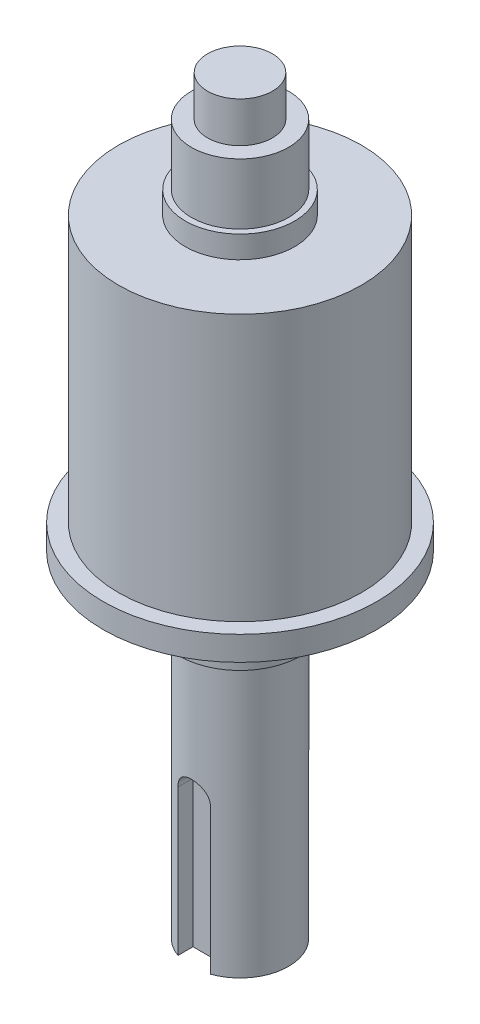
ISO-10303-21;
HEADER;
FILE_DESCRIPTION(('STEP AP214'),'2;1');
FILE_NAME('part.step','',(''),(''),'','','');
FILE_SCHEMA(('AUTOMOTIVE_DESIGN { 1 0 10303 214 1 1 1 1 }'));
ENDSEC;
DATA;
#1=APPLICATION_CONTEXT('core data for automotive mechanical design processes');
#2=APPLICATION_PROTOCOL_DEFINITION('international standard','automotive_design',2000,#1);
#3=PRODUCT_CONTEXT('',#1,'mechanical');
#4=PRODUCT('Part','Part','',(#3));
#5=PRODUCT_RELATED_PRODUCT_CATEGORY('part','',(#4));
#6=PRODUCT_DEFINITION_FORMATION('','',#4);
#7=PRODUCT_DEFINITION_CONTEXT('part definition',#1,'design');
#8=PRODUCT_DEFINITION('design','',#6,#7);
#9=PRODUCT_DEFINITION_SHAPE('','',#8);
#10=(LENGTH_UNIT() NAMED_UNIT(*) SI_UNIT(.MILLI.,.METRE.));
#11=(NAMED_UNIT(*) PLANE_ANGLE_UNIT() SI_UNIT($,.RADIAN.));
#12=(NAMED_UNIT(*) SI_UNIT($,.STERADIAN.) SOLID_ANGLE_UNIT());
#13=UNCERTAINTY_MEASURE_WITH_UNIT(LENGTH_MEASURE(1.E-05),#10,'distance_accuracy_value','');
#14=(GEOMETRIC_REPRESENTATION_CONTEXT(3) GLOBAL_UNCERTAINTY_ASSIGNED_CONTEXT((#13)) GLOBAL_UNIT_ASSIGNED_CONTEXT((#10,
#11,#12)) REPRESENTATION_CONTEXT('',''));
#15=CARTESIAN_POINT('',(0.,0.,0.));
#16=DIRECTION('',(0.,0.,1.));
#17=DIRECTION('',(1.,0.,0.));
#18=AXIS2_PLACEMENT_3D('',#15,#16,#17);
#19=CARTESIAN_POINT('',(0.,40.0334496894889,0.));
#20=DIRECTION('',(0.,1.,0.));
#21=DIRECTION('',(0.,0.,1.));
#22=AXIS2_PLACEMENT_3D('',#19,#20,#21);
#23=CYLINDRICAL_SURFACE('',#22,6.);
#24=CARTESIAN_POINT('',(0.,-58.61,0.));
#25=DIRECTION('',(0.,1.,0.));
#26=DIRECTION('',(0.,0.,1.));
#27=AXIS2_PLACEMENT_3D('',#24,#25,#26);
#28=CIRCLE('',#27,6.);
#29=CARTESIAN_POINT('',(0.,-58.61,6.));
#30=VERTEX_POINT('',#29);
#31=EDGE_CURVE('E116',#30,#30,#28,.T.);
#32=ORIENTED_EDGE('',*,*,#31,.F.);
#33=EDGE_LOOP('',(#32));
#34=FACE_BOUND('',#33,.T.);
#35=CARTESIAN_POINT('',(-2.,-74.535,5.65685424949238));
#36=CARTESIAN_POINT('',(-2.0000014949184,-74.4804190063978,5.65684884188678));
#37=CARTESIAN_POINT('',(-1.99776424917478,-74.4258658756214,5.6576451988649));
#38=CARTESIAN_POINT('',(-1.9888512140728,-74.3171828318902,5.66078654578441));
#39=CARTESIAN_POINT('',(-1.98217662286705,-74.2630528086806,5.66313111768244));
#40=CARTESIAN_POINT('',(-1.95562135046158,-74.1022157136097,5.67238184449301));
#41=CARTESIAN_POINT('',(-1.92920846605623,-73.9966383074591,5.6815058499903));
#42=CARTESIAN_POINT('',(-1.85991682366086,-73.7917496151125,5.70456149397718));
#43=CARTESIAN_POINT('',(-1.81704715197507,-73.6924349062541,5.71849047905858));
#44=CARTESIAN_POINT('',(-1.71614645792974,-73.5023203319891,5.74957574438921));
#45=CARTESIAN_POINT('',(-1.65810612564547,-73.4115257418653,5.76673400456216));
#46=CARTESIAN_POINT('',(-1.52610278704602,-73.2375595373509,5.80308960804095));
#47=CARTESIAN_POINT('',(-1.45164996064407,-73.1547702390748,5.82233755536618));
#48=CARTESIAN_POINT('',(-1.28997688598296,-73.0025879644166,5.86027697385955));
#49=CARTESIAN_POINT('',(-1.20275436910907,-72.9331973734881,5.87896834543705));
#50=CARTESIAN_POINT('',(-1.01520729191253,-72.8080409623916,5.91427765988454));
#51=CARTESIAN_POINT('',(-0.914600178716996,-72.7526780311955,5.93082875123708));
#52=CARTESIAN_POINT('',(-0.704858499931721,-72.6598154966255,5.95939217209316));
#53=CARTESIAN_POINT('',(-0.595726551186841,-72.6223104363591,5.97140588786619));
#54=CARTESIAN_POINT('',(-0.376058690956074,-72.5675285478173,5.98918142285845));
#55=CARTESIAN_POINT('',(-0.265703668920226,-72.5495934548926,5.99514617977146));
#56=CARTESIAN_POINT('',(-0.04339793891135,-72.5323674029488,6.00087216807633));
#57=CARTESIAN_POINT('',(0.0685523824907802,-72.5330720014605,6.00063487762604));
#58=CARTESIAN_POINT('',(0.286207690558779,-72.5526885662133,5.99412077270532));
#59=CARTESIAN_POINT('',(0.391985405251067,-72.5708852759189,5.98808121982527));
#60=CARTESIAN_POINT('',(0.598888128753307,-72.6237863973482,5.97093921001647));
#61=CARTESIAN_POINT('',(0.700012879232924,-72.6584917244125,5.95983647235462));
#62=CARTESIAN_POINT('',(0.89630524606192,-72.7438427392013,5.93351336542608));
#63=CARTESIAN_POINT('',(0.991377011307978,-72.7946920902447,5.91824075676625));
#64=CARTESIAN_POINT('',(1.17184917819497,-72.9107199027814,5.88516775360088));
#65=CARTESIAN_POINT('',(1.25724693942937,-72.975902262093,5.86736667195186));
#66=CARTESIAN_POINT('',(1.42019467942242,-73.1223420999937,5.83012543885479));
#67=CARTESIAN_POINT('',(1.49718722322539,-73.2042110872194,5.81064757359828));
#68=CARTESIAN_POINT('',(1.63654404964076,-73.3798829794323,5.77294980945703));
#69=CARTESIAN_POINT('',(1.69890360636762,-73.4736897248065,5.75473031831506));
#70=CARTESIAN_POINT('',(1.80800665118556,-73.6723603567065,5.72140062752635));
#71=CARTESIAN_POINT('',(1.85450601901536,-73.7773670298659,5.70634029896469));
#72=CARTESIAN_POINT('',(1.92892046140223,-73.9942939551799,5.68162194124078));
#73=CARTESIAN_POINT('',(1.95686487211071,-74.1062029867443,5.67195538817986));
#74=CARTESIAN_POINT('',(1.98331631256166,-74.271837273496,5.6627308418944));
#75=CARTESIAN_POINT('',(1.98957012251023,-74.3242827797085,5.66053335389204));
#76=CARTESIAN_POINT('',(1.99790923214239,-74.4294761567996,5.65759407142798));
#77=CARTESIAN_POINT('',(1.99999991078996,-74.4822235490888,5.65685039859056));
#78=CARTESIAN_POINT('',(2.,-74.535,5.65685424949238));
#79=B_SPLINE_CURVE_WITH_KNOTS('',3,(#35,#36,#37,#38,#39,#40,#41,#42,#43,#44,#45,#46,#47,#48,#49,
#50,#51,#52,#53,#54,#55,#56,#57,#58,#59,#60,#61,#62,#63,#64,#65,#66,#67,#68,#69,#70,#71,#72,#73,
#74,#75,#76,#77,#78),.UNSPECIFIED.,.F.,.F.,(4,2,2,2,2,2,2,2,2,2,2,2,2,2,2,2,2,2,2,2,2,4),(0.,
0.163636969470853,0.327229772338919,0.653162396790742,0.978915321932481,1.30486862627062,
1.64233009925356,1.97985159727495,2.32618265866202,2.67240782242254,3.00658941454805,
3.34069136061284,3.66168836931469,3.98270317816495,4.30794037651934,4.63326613177536,
4.97388108116099,5.31460588498483,5.66036059856078,6.00556734973678,6.16399790665503,
6.32222363058113),.UNSPECIFIED.);
#80=CARTESIAN_POINT('',(-2.,-74.535,5.65685424949238));
#81=VERTEX_POINT('',#80);
#82=CARTESIAN_POINT('',(2.,-74.535,5.65685424949238));
#83=VERTEX_POINT('',#82);
#84=EDGE_CURVE('E11',#81,#83,#79,.T.);
#85=ORIENTED_EDGE('',*,*,#84,.T.);
#86=DIRECTION('',(0.,-1.,0.));
#87=VECTOR('',#86,1.);
#88=CARTESIAN_POINT('',(2.,-77.535,5.65685424949237));
#89=LINE('',#88,#87);
#90=CARTESIAN_POINT('',(2.,-92.535,5.65685424949237));
#91=VERTEX_POINT('',#90);
#92=EDGE_CURVE('E91',#83,#91,#89,.T.);
#93=ORIENTED_EDGE('',*,*,#92,.T.);
#94=CARTESIAN_POINT('',(0.,-92.535,0.));
#95=DIRECTION('',(0.,1.,0.));
#96=DIRECTION('',(0.,0.,1.));
#97=AXIS2_PLACEMENT_3D('',#94,#95,#96);
#98=CIRCLE('',#97,6.);
#99=CARTESIAN_POINT('',(-2.,-92.535,5.65685424949238));
#100=VERTEX_POINT('',#99);
#101=EDGE_CURVE('E110',#91,#100,#98,.T.);
#102=ORIENTED_EDGE('',*,*,#101,.T.);
#103=DIRECTION('',(0.,-1.,0.));
#104=VECTOR('',#103,1.);
#105=CARTESIAN_POINT('',(-2.,-77.535,5.65685424949237));
#106=LINE('',#105,#104);
#107=EDGE_CURVE('E57',#81,#100,#106,.T.);
#108=ORIENTED_EDGE('',*,*,#107,.F.);
#109=EDGE_LOOP('',(#85,#93,#102,#108));
#110=FACE_BOUND('',#109,.T.);
#111=ADVANCED_FACE('F36',(#34,#110),#23,.T.);
#112=CARTESIAN_POINT('',(0.,0.,0.));
#113=DIRECTION('',(0.,1.,0.));
#114=DIRECTION('',(0.,0.,1.));
#115=AXIS2_PLACEMENT_3D('',#112,#113,#114);
#116=PLANE('',#115);
#117=CARTESIAN_POINT('',(0.,0.,0.));
#118=DIRECTION('',(0.,1.,0.));
#119=DIRECTION('',(0.,0.,1.));
#120=AXIS2_PLACEMENT_3D('',#117,#118,#119);
#121=CIRCLE('',#120,4.);
#122=CARTESIAN_POINT('',(0.,0.,4.));
#123=VERTEX_POINT('',#122);
#124=EDGE_CURVE('E50',#123,#123,#121,.T.);
#125=ORIENTED_EDGE('',*,*,#124,.T.);
#126=EDGE_LOOP('',(#125));
#127=FACE_BOUND('',#126,.T.);
#128=ADVANCED_FACE('F38',(#127),#116,.T.);
#129=CARTESIAN_POINT('',(0.,40.0334496894889,0.));
#130=DIRECTION('',(0.,1.,0.));
#131=DIRECTION('',(0.,0.,1.));
#132=AXIS2_PLACEMENT_3D('',#129,#130,#131);
#133=CYLINDRICAL_SURFACE('',#132,4.);
#134=CARTESIAN_POINT('',(0.,-5.,0.));
#135=DIRECTION('',(0.,1.,0.));
#136=DIRECTION('',(0.,0.,1.));
#137=AXIS2_PLACEMENT_3D('',#134,#135,#136);
#138=CIRCLE('',#137,4.);
#139=CARTESIAN_POINT('',(0.,-5.,4.));
#140=VERTEX_POINT('',#139);
#141=EDGE_CURVE('E155',#140,#140,#138,.T.);
#142=ORIENTED_EDGE('',*,*,#141,.T.);
#143=EDGE_LOOP('',(#142));
#144=FACE_BOUND('',#143,.T.);
#145=ORIENTED_EDGE('',*,*,#124,.F.);
#146=EDGE_LOOP('',(#145));
#147=FACE_BOUND('',#146,.T.);
#148=ADVANCED_FACE('F161',(#144,#147),#133,.T.);
#149=CARTESIAN_POINT('',(-4.,-5.,0.));
#150=DIRECTION('',(0.,1.,0.));
#151=DIRECTION('',(0.,0.,1.));
#152=AXIS2_PLACEMENT_3D('',#149,#150,#151);
#153=PLANE('',#152);
#154=CARTESIAN_POINT('',(0.,-5.,0.));
#155=DIRECTION('',(0.,1.,0.));
#156=DIRECTION('',(0.,0.,1.));
#157=AXIS2_PLACEMENT_3D('',#154,#155,#156);
#158=CIRCLE('',#157,6.);
#159=CARTESIAN_POINT('',(0.,-5.,6.));
#160=VERTEX_POINT('',#159);
#161=EDGE_CURVE('E152',#160,#160,#158,.T.);
#162=ORIENTED_EDGE('',*,*,#161,.T.);
#163=EDGE_LOOP('',(#162));
#164=FACE_BOUND('',#163,.T.);
#165=ORIENTED_EDGE('',*,*,#141,.F.);
#166=EDGE_LOOP('',(#165));
#167=FACE_BOUND('',#166,.T.);
#168=ADVANCED_FACE('F163',(#164,#167),#153,.T.);
#169=CARTESIAN_POINT('',(0.,40.0334496894889,0.));
#170=DIRECTION('',(0.,1.,0.));
#171=DIRECTION('',(0.,0.,1.));
#172=AXIS2_PLACEMENT_3D('',#169,#170,#171);
#173=CYLINDRICAL_SURFACE('',#172,6.);
#174=CARTESIAN_POINT('',(0.,-12.5,0.));
#175=DIRECTION('',(0.,1.,0.));
#176=DIRECTION('',(0.,0.,1.));
#177=AXIS2_PLACEMENT_3D('',#174,#175,#176);
#178=CIRCLE('',#177,6.);
#179=CARTESIAN_POINT('',(0.,-12.5,6.));
#180=VERTEX_POINT('',#179);
#181=EDGE_CURVE('E149',#180,#180,#178,.T.);
#182=ORIENTED_EDGE('',*,*,#181,.T.);
#183=EDGE_LOOP('',(#182));
#184=FACE_BOUND('',#183,.T.);
#185=ORIENTED_EDGE('',*,*,#161,.F.);
#186=EDGE_LOOP('',(#185));
#187=FACE_BOUND('',#186,.T.);
#188=ADVANCED_FACE('F169',(#184,#187),#173,.T.);
#189=CARTESIAN_POINT('',(-6.,-12.5,0.));
#190=DIRECTION('',(0.,1.,0.));
#191=DIRECTION('',(0.,0.,1.));
#192=AXIS2_PLACEMENT_3D('',#189,#190,#191);
#193=PLANE('',#192);
#194=CARTESIAN_POINT('',(0.,-12.5,0.));
#195=DIRECTION('',(0.,1.,0.));
#196=DIRECTION('',(0.,0.,1.));
#197=AXIS2_PLACEMENT_3D('',#194,#195,#196);
#198=CIRCLE('',#197,6.75);
#199=CARTESIAN_POINT('',(0.,-12.5,6.75));
#200=VERTEX_POINT('',#199);
#201=EDGE_CURVE('E146',#200,#200,#198,.T.);
#202=ORIENTED_EDGE('',*,*,#201,.T.);
#203=EDGE_LOOP('',(#202));
#204=FACE_BOUND('',#203,.T.);
#205=ORIENTED_EDGE('',*,*,#181,.F.);
#206=EDGE_LOOP('',(#205));
#207=FACE_BOUND('',#206,.T.);
#208=ADVANCED_FACE('F222',(#204,#207),#193,.T.);
#209=CARTESIAN_POINT('',(0.,40.0334496894889,0.));
#210=DIRECTION('',(0.,1.,0.));
#211=DIRECTION('',(0.,0.,1.));
#212=AXIS2_PLACEMENT_3D('',#209,#210,#211);
#213=CYLINDRICAL_SURFACE('',#212,6.75);
#214=CARTESIAN_POINT('',(0.,-15.25,0.));
#215=DIRECTION('',(0.,1.,0.));
#216=DIRECTION('',(0.,0.,1.));
#217=AXIS2_PLACEMENT_3D('',#214,#215,#216);
#218=CIRCLE('',#217,6.75);
#219=CARTESIAN_POINT('',(0.,-15.25,6.75));
#220=VERTEX_POINT('',#219);
#221=EDGE_CURVE('E143',#220,#220,#218,.T.);
#222=ORIENTED_EDGE('',*,*,#221,.T.);
#223=EDGE_LOOP('',(#222));
#224=FACE_BOUND('',#223,.T.);
#225=ORIENTED_EDGE('',*,*,#201,.F.);
#226=EDGE_LOOP('',(#225));
#227=FACE_BOUND('',#226,.T.);
#228=ADVANCED_FACE('F218',(#224,#227),#213,.T.);
#229=CARTESIAN_POINT('',(-6.75,-15.25,0.));
#230=DIRECTION('',(0.,1.,0.));
#231=DIRECTION('',(0.,0.,1.));
#232=AXIS2_PLACEMENT_3D('',#229,#230,#231);
#233=PLANE('',#232);
#234=CARTESIAN_POINT('',(0.,-15.25,0.));
#235=DIRECTION('',(0.,1.,0.));
#236=DIRECTION('',(0.,0.,1.));
#237=AXIS2_PLACEMENT_3D('',#234,#235,#236);
#238=CIRCLE('',#237,14.9815);
#239=CARTESIAN_POINT('',(0.,-15.25,14.9815));
#240=VERTEX_POINT('',#239);
#241=EDGE_CURVE('E140',#240,#240,#238,.T.);
#242=ORIENTED_EDGE('',*,*,#241,.T.);
#243=EDGE_LOOP('',(#242));
#244=FACE_BOUND('',#243,.T.);
#245=ORIENTED_EDGE('',*,*,#221,.F.);
#246=EDGE_LOOP('',(#245));
#247=FACE_BOUND('',#246,.T.);
#248=ADVANCED_FACE('F214',(#244,#247),#233,.T.);
#249=CARTESIAN_POINT('',(0.,40.0334496894889,0.));
#250=DIRECTION('',(0.,1.,0.));
#251=DIRECTION('',(0.,0.,1.));
#252=AXIS2_PLACEMENT_3D('',#249,#250,#251);
#253=CYLINDRICAL_SURFACE('',#252,14.9815);
#254=CARTESIAN_POINT('',(0.,-48.11,0.));
#255=DIRECTION('',(0.,1.,0.));
#256=DIRECTION('',(0.,0.,1.));
#257=AXIS2_PLACEMENT_3D('',#254,#255,#256);
#258=CIRCLE('',#257,14.9815);
#259=CARTESIAN_POINT('',(0.,-48.11,14.9815));
#260=VERTEX_POINT('',#259);
#261=EDGE_CURVE('E137',#260,#260,#258,.T.);
#262=ORIENTED_EDGE('',*,*,#261,.T.);
#263=EDGE_LOOP('',(#262));
#264=FACE_BOUND('',#263,.T.);
#265=ORIENTED_EDGE('',*,*,#241,.F.);
#266=EDGE_LOOP('',(#265));
#267=FACE_BOUND('',#266,.T.);
#268=ADVANCED_FACE('F210',(#264,#267),#253,.T.);
#269=CARTESIAN_POINT('',(-16.8815,-48.11,0.));
#270=DIRECTION('',(0.,1.,0.));
#271=DIRECTION('',(0.,0.,1.));
#272=AXIS2_PLACEMENT_3D('',#269,#270,#271);
#273=PLANE('',#272);
#274=CARTESIAN_POINT('',(0.,-48.11,0.));
#275=DIRECTION('',(0.,1.,0.));
#276=DIRECTION('',(0.,0.,1.));
#277=AXIS2_PLACEMENT_3D('',#274,#275,#276);
#278=CIRCLE('',#277,16.8815);
#279=CARTESIAN_POINT('',(0.,-48.11,16.8815));
#280=VERTEX_POINT('',#279);
#281=EDGE_CURVE('E134',#280,#280,#278,.T.);
#282=ORIENTED_EDGE('',*,*,#281,.T.);
#283=EDGE_LOOP('',(#282));
#284=FACE_BOUND('',#283,.T.);
#285=ORIENTED_EDGE('',*,*,#261,.F.);
#286=EDGE_LOOP('',(#285));
#287=FACE_BOUND('',#286,.T.);
#288=ADVANCED_FACE('F206',(#284,#287),#273,.T.);
#289=CARTESIAN_POINT('',(0.,40.0334496894889,0.));
#290=DIRECTION('',(0.,1.,0.));
#291=DIRECTION('',(0.,0.,1.));
#292=AXIS2_PLACEMENT_3D('',#289,#290,#291);
#293=CYLINDRICAL_SURFACE('',#292,16.8815);
#294=CARTESIAN_POINT('',(0.,-51.11,0.));
#295=DIRECTION('',(0.,1.,0.));
#296=DIRECTION('',(0.,0.,1.));
#297=AXIS2_PLACEMENT_3D('',#294,#295,#296);
#298=CIRCLE('',#297,16.8815);
#299=CARTESIAN_POINT('',(0.,-51.11,16.8815));
#300=VERTEX_POINT('',#299);
#301=EDGE_CURVE('E131',#300,#300,#298,.T.);
#302=ORIENTED_EDGE('',*,*,#301,.T.);
#303=EDGE_LOOP('',(#302));
#304=FACE_BOUND('',#303,.T.);
#305=ORIENTED_EDGE('',*,*,#281,.F.);
#306=EDGE_LOOP('',(#305));
#307=FACE_BOUND('',#306,.T.);
#308=ADVANCED_FACE('F202',(#304,#307),#293,.T.);
#309=CARTESIAN_POINT('',(-16.8815,-51.11,0.));
#310=DIRECTION('',(0.,-1.,0.));
#311=DIRECTION('',(0.,0.,-1.));
#312=AXIS2_PLACEMENT_3D('',#309,#310,#311);
#313=PLANE('',#312);
#314=CARTESIAN_POINT('',(0.,-51.11,0.));
#315=DIRECTION('',(0.,1.,0.));
#316=DIRECTION('',(0.,0.,1.));
#317=AXIS2_PLACEMENT_3D('',#314,#315,#316);
#318=CIRCLE('',#317,8.25);
#319=CARTESIAN_POINT('',(0.,-51.11,8.25));
#320=VERTEX_POINT('',#319);
#321=EDGE_CURVE('E128',#320,#320,#318,.T.);
#322=ORIENTED_EDGE('',*,*,#321,.T.);
#323=EDGE_LOOP('',(#322));
#324=FACE_BOUND('',#323,.T.);
#325=ORIENTED_EDGE('',*,*,#301,.F.);
#326=EDGE_LOOP('',(#325));
#327=FACE_BOUND('',#326,.T.);
#328=ADVANCED_FACE('F198',(#324,#327),#313,.T.);
#329=CARTESIAN_POINT('',(0.,40.0334496894889,0.));
#330=DIRECTION('',(0.,1.,0.));
#331=DIRECTION('',(0.,0.,1.));
#332=AXIS2_PLACEMENT_3D('',#329,#330,#331);
#333=CYLINDRICAL_SURFACE('',#332,8.25);
#334=CARTESIAN_POINT('',(0.,-53.61,0.));
#335=DIRECTION('',(0.,1.,0.));
#336=DIRECTION('',(0.,0.,1.));
#337=AXIS2_PLACEMENT_3D('',#334,#335,#336);
#338=CIRCLE('',#337,8.25);
#339=CARTESIAN_POINT('',(0.,-53.61,8.25));
#340=VERTEX_POINT('',#339);
#341=EDGE_CURVE('E125',#340,#340,#338,.T.);
#342=ORIENTED_EDGE('',*,*,#341,.T.);
#343=EDGE_LOOP('',(#342));
#344=FACE_BOUND('',#343,.T.);
#345=ORIENTED_EDGE('',*,*,#321,.F.);
#346=EDGE_LOOP('',(#345));
#347=FACE_BOUND('',#346,.T.);
#348=ADVANCED_FACE('F194',(#344,#347),#333,.T.);
#349=CARTESIAN_POINT('',(-8.25,-53.61,0.));
#350=DIRECTION('',(0.,-1.,0.));
#351=DIRECTION('',(0.,0.,-1.));
#352=AXIS2_PLACEMENT_3D('',#349,#350,#351);
#353=PLANE('',#352);
#354=CARTESIAN_POINT('',(0.,-53.61,0.));
#355=DIRECTION('',(0.,1.,0.));
#356=DIRECTION('',(0.,0.,1.));
#357=AXIS2_PLACEMENT_3D('',#354,#355,#356);
#358=CIRCLE('',#357,7.5);
#359=CARTESIAN_POINT('',(0.,-53.61,7.5));
#360=VERTEX_POINT('',#359);
#361=EDGE_CURVE('E122',#360,#360,#358,.T.);
#362=ORIENTED_EDGE('',*,*,#361,.T.);
#363=EDGE_LOOP('',(#362));
#364=FACE_BOUND('',#363,.T.);
#365=ORIENTED_EDGE('',*,*,#341,.F.);
#366=EDGE_LOOP('',(#365));
#367=FACE_BOUND('',#366,.T.);
#368=ADVANCED_FACE('F190',(#364,#367),#353,.T.);
#369=CARTESIAN_POINT('',(0.,40.0334496894889,0.));
#370=DIRECTION('',(0.,1.,0.));
#371=DIRECTION('',(0.,0.,1.));
#372=AXIS2_PLACEMENT_3D('',#369,#370,#371);
#373=CYLINDRICAL_SURFACE('',#372,7.5);
#374=CARTESIAN_POINT('',(0.,-58.61,0.));
#375=DIRECTION('',(0.,1.,0.));
#376=DIRECTION('',(0.,0.,1.));
#377=AXIS2_PLACEMENT_3D('',#374,#375,#376);
#378=CIRCLE('',#377,7.5);
#379=CARTESIAN_POINT('',(0.,-58.61,7.5));
#380=VERTEX_POINT('',#379);
#381=EDGE_CURVE('E119',#380,#380,#378,.T.);
#382=ORIENTED_EDGE('',*,*,#381,.T.);
#383=EDGE_LOOP('',(#382));
#384=FACE_BOUND('',#383,.T.);
#385=ORIENTED_EDGE('',*,*,#361,.F.);
#386=EDGE_LOOP('',(#385));
#387=FACE_BOUND('',#386,.T.);
#388=ADVANCED_FACE('F186',(#384,#387),#373,.T.);
#389=CARTESIAN_POINT('',(-7.5,-58.61,0.));
#390=DIRECTION('',(0.,-1.,0.));
#391=DIRECTION('',(0.,0.,-1.));
#392=AXIS2_PLACEMENT_3D('',#389,#390,#391);
#393=PLANE('',#392);
#394=ORIENTED_EDGE('',*,*,#31,.T.);
#395=EDGE_LOOP('',(#394));
#396=FACE_BOUND('',#395,.T.);
#397=ORIENTED_EDGE('',*,*,#381,.F.);
#398=EDGE_LOOP('',(#397));
#399=FACE_BOUND('',#398,.T.);
#400=ADVANCED_FACE('F183',(#396,#399),#393,.T.);
#401=CARTESIAN_POINT('',(-6.,-92.535,0.));
#402=DIRECTION('',(0.,-1.,0.));
#403=DIRECTION('',(0.,0.,-1.));
#404=AXIS2_PLACEMENT_3D('',#401,#402,#403);
#405=PLANE('',#404);
#406=DIRECTION('',(0.,0.,1.));
#407=VECTOR('',#406,1.);
#408=CARTESIAN_POINT('',(2.,-92.535,3.80000000000001));
#409=LINE('',#408,#407);
#410=CARTESIAN_POINT('',(2.,-92.535,3.80000000000001));
#411=VERTEX_POINT('',#410);
#412=EDGE_CURVE('E65',#411,#91,#409,.T.);
#413=ORIENTED_EDGE('',*,*,#412,.F.);
#414=DIRECTION('',(1.,0.,0.));
#415=VECTOR('',#414,1.);
#416=CARTESIAN_POINT('',(-2.,-92.535,3.80000000000001));
#417=LINE('',#416,#415);
#418=CARTESIAN_POINT('',(-2.,-92.535,3.80000000000001));
#419=VERTEX_POINT('',#418);
#420=EDGE_CURVE('E90',#419,#411,#417,.T.);
#421=ORIENTED_EDGE('',*,*,#420,.F.);
#422=DIRECTION('',(0.,0.,-1.));
#423=VECTOR('',#422,1.);
#424=CARTESIAN_POINT('',(-2.,-92.535,5.65685424949237));
#425=LINE('',#424,#423);
#426=EDGE_CURVE('E99',#100,#419,#425,.T.);
#427=ORIENTED_EDGE('',*,*,#426,.F.);
#428=ORIENTED_EDGE('',*,*,#101,.F.);
#429=EDGE_LOOP('',(#413,#421,#427,#428));
#430=FACE_BOUND('',#429,.T.);
#431=ADVANCED_FACE('F181',(#430),#405,.T.);
#432=CARTESIAN_POINT('',(2.,-77.535,3.80000000000001));
#433=DIRECTION('',(1.,0.,0.));
#434=DIRECTION('',(0.,0.,-1.));
#435=AXIS2_PLACEMENT_3D('',#432,#433,#434);
#436=PLANE('',#435);
#437=ORIENTED_EDGE('',*,*,#412,.T.);
#438=ORIENTED_EDGE('',*,*,#92,.F.);
#439=DIRECTION('',(0.,0.,-1.));
#440=VECTOR('',#439,1.);
#441=CARTESIAN_POINT('',(2.,-74.535,16.8815));
#442=LINE('',#441,#440);
#443=CARTESIAN_POINT('',(2.,-74.535,3.80000000000001));
#444=VERTEX_POINT('',#443);
#445=EDGE_CURVE('E95',#83,#444,#442,.T.);
#446=ORIENTED_EDGE('',*,*,#445,.T.);
#447=DIRECTION('',(0.,-1.,0.));
#448=VECTOR('',#447,1.);
#449=CARTESIAN_POINT('',(2.,-77.535,3.80000000000001));
#450=LINE('',#449,#448);
#451=EDGE_CURVE('E84',#444,#411,#450,.T.);
#452=ORIENTED_EDGE('',*,*,#451,.T.);
#453=EDGE_LOOP('',(#437,#438,#446,#452));
#454=FACE_BOUND('',#453,.T.);
#455=ADVANCED_FACE('F96',(#454),#436,.F.);
#456=CARTESIAN_POINT('',(-2.,-77.535,3.80000000000001));
#457=DIRECTION('',(0.,0.,-1.));
#458=DIRECTION('',(-1.,0.,0.));
#459=AXIS2_PLACEMENT_3D('',#456,#457,#458);
#460=PLANE('',#459);
#461=ORIENTED_EDGE('',*,*,#420,.T.);
#462=ORIENTED_EDGE('',*,*,#451,.F.);
#463=CARTESIAN_POINT('',(0.,-74.535,3.80000000000001));
#464=DIRECTION('',(0.,0.,1.));
#465=DIRECTION('',(-1.,0.,0.));
#466=AXIS2_PLACEMENT_3D('',#463,#464,#465);
#467=CIRCLE('',#466,2.);
#468=CARTESIAN_POINT('',(-2.,-74.535,3.80000000000001));
#469=VERTEX_POINT('',#468);
#470=EDGE_CURVE('E88',#444,#469,#467,.T.);
#471=ORIENTED_EDGE('',*,*,#470,.T.);
#472=DIRECTION('',(0.,-1.,0.));
#473=VECTOR('',#472,1.);
#474=CARTESIAN_POINT('',(-2.,-77.535,3.80000000000001));
#475=LINE('',#474,#473);
#476=EDGE_CURVE('E92',#469,#419,#475,.T.);
#477=ORIENTED_EDGE('',*,*,#476,.T.);
#478=EDGE_LOOP('',(#461,#462,#471,#477));
#479=FACE_BOUND('',#478,.T.);
#480=ADVANCED_FACE('F86',(#479),#460,.F.);
#481=CARTESIAN_POINT('',(-2.,-77.535,5.65685424949237));
#482=DIRECTION('',(-1.,0.,0.));
#483=DIRECTION('',(0.,0.,1.));
#484=AXIS2_PLACEMENT_3D('',#481,#482,#483);
#485=PLANE('',#484);
#486=ORIENTED_EDGE('',*,*,#426,.T.);
#487=ORIENTED_EDGE('',*,*,#476,.F.);
#488=DIRECTION('',(0.,0.,-1.));
#489=VECTOR('',#488,1.);
#490=CARTESIAN_POINT('',(-2.,-74.535,16.8815));
#491=LINE('',#490,#489);
#492=EDGE_CURVE('E100',#81,#469,#491,.T.);
#493=ORIENTED_EDGE('',*,*,#492,.F.);
#494=ORIENTED_EDGE('',*,*,#107,.T.);
#495=EDGE_LOOP('',(#486,#487,#493,#494));
#496=FACE_BOUND('',#495,.T.);
#497=ADVANCED_FACE('F301',(#496),#485,.F.);
#498=CARTESIAN_POINT('',(0.,-74.535,16.8815));
#499=DIRECTION('',(0.,0.,-1.));
#500=DIRECTION('',(-1.,0.,0.));
#501=AXIS2_PLACEMENT_3D('',#498,#499,#500);
#502=CYLINDRICAL_SURFACE('',#501,2.);
#503=ORIENTED_EDGE('',*,*,#492,.T.);
#504=ORIENTED_EDGE('',*,*,#470,.F.);
#505=ORIENTED_EDGE('',*,*,#445,.F.);
#506=ORIENTED_EDGE('',*,*,#84,.F.);
#507=EDGE_LOOP('',(#503,#504,#505,#506));
#508=FACE_BOUND('',#507,.T.);
#509=ADVANCED_FACE('F103',(#508),#502,.F.);
#510=CLOSED_SHELL('',(#111,#128,#148,#168,#188,#208,#228,#248,#268,#288,#308,#328,#348,#368,
#388,#400,#431,#455,#480,#497,#509));
#511=MANIFOLD_SOLID_BREP('B2',#510);
#512=ADVANCED_BREP_SHAPE_REPRESENTATION('',(#18,#511),#14);
#513=SHAPE_DEFINITION_REPRESENTATION(#9,#512);
ENDSEC;
END-ISO-10303-21;
